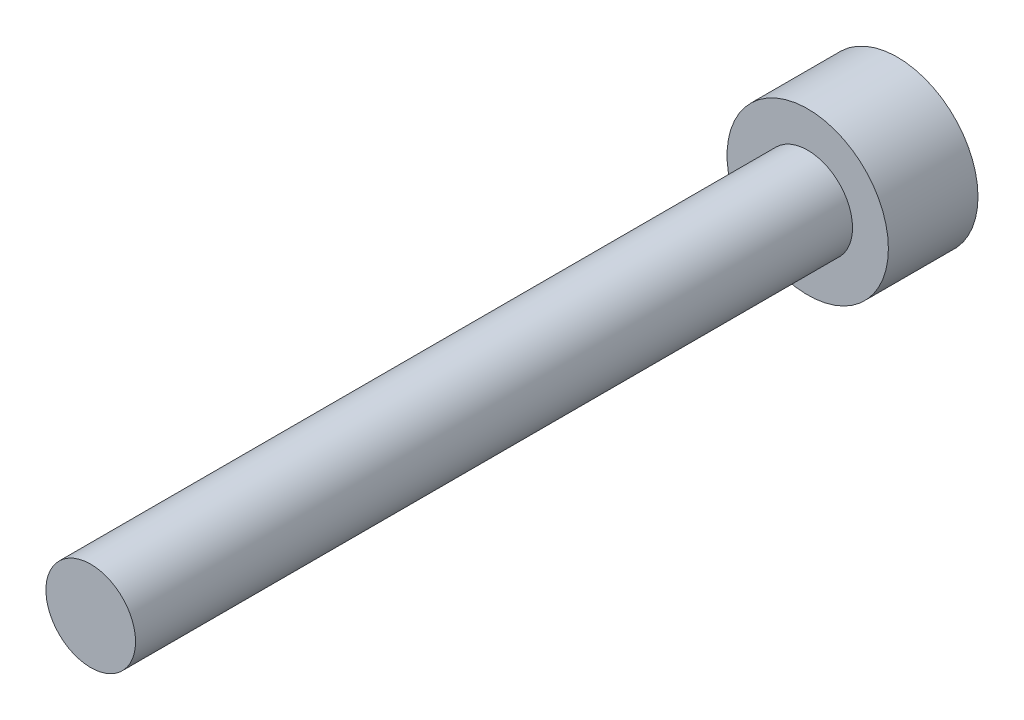
ISO-10303-21;
HEADER;
FILE_DESCRIPTION(('STEP AP214'),'2;1');
FILE_NAME('part.step','',(''),(''),'','','');
FILE_SCHEMA(('AUTOMOTIVE_DESIGN { 1 0 10303 214 1 1 1 1 }'));
ENDSEC;
DATA;
#1=APPLICATION_CONTEXT('core data for automotive mechanical design processes');
#2=APPLICATION_PROTOCOL_DEFINITION('international standard','automotive_design',2000,#1);
#3=PRODUCT_CONTEXT('',#1,'mechanical');
#4=PRODUCT('Part','Part','',(#3));
#5=PRODUCT_RELATED_PRODUCT_CATEGORY('part','',(#4));
#6=PRODUCT_DEFINITION_FORMATION('','',#4);
#7=PRODUCT_DEFINITION_CONTEXT('part definition',#1,'design');
#8=PRODUCT_DEFINITION('design','',#6,#7);
#9=PRODUCT_DEFINITION_SHAPE('','',#8);
#10=(LENGTH_UNIT() NAMED_UNIT(*) SI_UNIT(.MILLI.,.METRE.));
#11=(NAMED_UNIT(*) PLANE_ANGLE_UNIT() SI_UNIT($,.RADIAN.));
#12=(NAMED_UNIT(*) SI_UNIT($,.STERADIAN.) SOLID_ANGLE_UNIT());
#13=UNCERTAINTY_MEASURE_WITH_UNIT(LENGTH_MEASURE(1.E-05),#10,'distance_accuracy_value','');
#14=(GEOMETRIC_REPRESENTATION_CONTEXT(3) GLOBAL_UNCERTAINTY_ASSIGNED_CONTEXT((#13)) GLOBAL_UNIT_ASSIGNED_CONTEXT((#10,
#11,#12)) REPRESENTATION_CONTEXT('',''));
#15=CARTESIAN_POINT('',(0.,0.,0.));
#16=DIRECTION('',(0.,0.,1.));
#17=DIRECTION('',(1.,0.,0.));
#18=AXIS2_PLACEMENT_3D('',#15,#16,#17);
#19=CARTESIAN_POINT('',(0.,0.,-2.5));
#20=DIRECTION('',(0.,0.,1.));
#21=DIRECTION('',(1.,0.,0.));
#22=AXIS2_PLACEMENT_3D('',#19,#20,#21);
#23=PLANE('',#22);
#24=CARTESIAN_POINT('',(0.,0.,-2.5));
#25=DIRECTION('',(0.,0.,1.));
#26=DIRECTION('',(1.,0.,0.));
#27=AXIS2_PLACEMENT_3D('',#24,#25,#26);
#28=CIRCLE('',#27,2.25);
#29=CARTESIAN_POINT('',(2.25,0.,-2.5));
#30=VERTEX_POINT('',#29);
#31=EDGE_CURVE('E50',#30,#30,#28,.T.);
#32=ORIENTED_EDGE('',*,*,#31,.F.);
#33=EDGE_LOOP('',(#32));
#34=FACE_BOUND('',#33,.T.);
#35=DIRECTION('',(0.866025403784441,-0.499999999999995,0.));
#36=VECTOR('',#35,1.);
#37=CARTESIAN_POINT('',(-0.999999999999993,-0.577350269189637,-2.5));
#38=LINE('',#37,#36);
#39=CARTESIAN_POINT('',(-0.999999999999993,-0.577350269189637,-2.5));
#40=VERTEX_POINT('',#39);
#41=CARTESIAN_POINT('',(0.,-1.15470053837925,-2.5));
#42=VERTEX_POINT('',#41);
#43=EDGE_CURVE('E61',#40,#42,#38,.T.);
#44=ORIENTED_EDGE('',*,*,#43,.T.);
#45=DIRECTION('',(0.866025403784438,0.500000000000001,0.));
#46=VECTOR('',#45,1.);
#47=CARTESIAN_POINT('',(0.,-1.15470053837925,-2.5));
#48=LINE('',#47,#46);
#49=CARTESIAN_POINT('',(1.,-0.577350269189624,-2.5));
#50=VERTEX_POINT('',#49);
#51=EDGE_CURVE('E139',#42,#50,#48,.T.);
#52=ORIENTED_EDGE('',*,*,#51,.T.);
#53=DIRECTION('',(0.,1.,0.));
#54=VECTOR('',#53,1.);
#55=CARTESIAN_POINT('',(1.,-0.577350269189624,-2.5));
#56=LINE('',#55,#54);
#57=CARTESIAN_POINT('',(0.999999999999998,0.57735026918963,-2.5));
#58=VERTEX_POINT('',#57);
#59=EDGE_CURVE('E142',#50,#58,#56,.T.);
#60=ORIENTED_EDGE('',*,*,#59,.T.);
#61=DIRECTION('',(-0.866025403784442,0.499999999999995,0.));
#62=VECTOR('',#61,1.);
#63=CARTESIAN_POINT('',(0.999999999999998,0.57735026918963,-2.5));
#64=LINE('',#63,#62);
#65=CARTESIAN_POINT('',(0.,1.15470053837925,-2.5));
#66=VERTEX_POINT('',#65);
#67=EDGE_CURVE('E148',#58,#66,#64,.T.);
#68=ORIENTED_EDGE('',*,*,#67,.T.);
#69=DIRECTION('',(-0.866025403784434,-0.500000000000007,0.));
#70=VECTOR('',#69,1.);
#71=CARTESIAN_POINT('',(0.,1.15470053837925,-2.5));
#72=LINE('',#71,#70);
#73=CARTESIAN_POINT('',(-1.00000000000001,0.577350269189617,-2.5));
#74=VERTEX_POINT('',#73);
#75=EDGE_CURVE('E124',#66,#74,#72,.T.);
#76=ORIENTED_EDGE('',*,*,#75,.T.);
#77=DIRECTION('',(0.,-1.,0.));
#78=VECTOR('',#77,1.);
#79=CARTESIAN_POINT('',(-1.00000000000001,0.577350269189617,-2.5));
#80=LINE('',#79,#78);
#81=EDGE_CURVE('E151',#74,#40,#80,.T.);
#82=ORIENTED_EDGE('',*,*,#81,.T.);
#83=EDGE_LOOP('',(#44,#52,#60,#68,#76,#82));
#84=FACE_BOUND('',#83,.T.);
#85=ADVANCED_FACE('F43',(#34,#84),#23,.F.);
#86=CARTESIAN_POINT('',(0.,0.,0.));
#87=DIRECTION('',(0.,0.,-1.));
#88=DIRECTION('',(-1.,0.,0.));
#89=AXIS2_PLACEMENT_3D('',#86,#87,#88);
#90=CYLINDRICAL_SURFACE('',#89,2.25);
#91=CARTESIAN_POINT('',(0.,0.,0.));
#92=DIRECTION('',(0.,0.,1.));
#93=DIRECTION('',(1.,0.,0.));
#94=AXIS2_PLACEMENT_3D('',#91,#92,#93);
#95=CIRCLE('',#94,2.25);
#96=CARTESIAN_POINT('',(2.25,0.,0.));
#97=VERTEX_POINT('',#96);
#98=EDGE_CURVE('E52',#97,#97,#95,.T.);
#99=ORIENTED_EDGE('',*,*,#98,.F.);
#100=EDGE_LOOP('',(#99));
#101=FACE_BOUND('',#100,.T.);
#102=ORIENTED_EDGE('',*,*,#31,.T.);
#103=EDGE_LOOP('',(#102));
#104=FACE_BOUND('',#103,.T.);
#105=ADVANCED_FACE('F44',(#101,#104),#90,.T.);
#106=CARTESIAN_POINT('',(0.,0.,0.));
#107=DIRECTION('',(0.,0.,1.));
#108=DIRECTION('',(1.,0.,0.));
#109=AXIS2_PLACEMENT_3D('',#106,#107,#108);
#110=PLANE('',#109);
#111=CARTESIAN_POINT('',(0.,0.,0.));
#112=DIRECTION('',(0.,0.,1.));
#113=DIRECTION('',(1.,0.,0.));
#114=AXIS2_PLACEMENT_3D('',#111,#112,#113);
#115=CIRCLE('',#114,1.25);
#116=CARTESIAN_POINT('',(1.25,0.,0.));
#117=VERTEX_POINT('',#116);
#118=EDGE_CURVE('E11',#117,#117,#115,.T.);
#119=ORIENTED_EDGE('',*,*,#118,.F.);
#120=EDGE_LOOP('',(#119));
#121=FACE_BOUND('',#120,.T.);
#122=ORIENTED_EDGE('',*,*,#98,.T.);
#123=EDGE_LOOP('',(#122));
#124=FACE_BOUND('',#123,.T.);
#125=ADVANCED_FACE('F211',(#121,#124),#110,.T.);
#126=CARTESIAN_POINT('',(0.,0.,20.));
#127=DIRECTION('',(0.,0.,-1.));
#128=DIRECTION('',(-1.,0.,0.));
#129=AXIS2_PLACEMENT_3D('',#126,#127,#128);
#130=CYLINDRICAL_SURFACE('',#129,1.25);
#131=CARTESIAN_POINT('',(0.,0.,20.));
#132=DIRECTION('',(0.,0.,1.));
#133=DIRECTION('',(1.,0.,0.));
#134=AXIS2_PLACEMENT_3D('',#131,#132,#133);
#135=CIRCLE('',#134,1.25);
#136=CARTESIAN_POINT('',(1.25,0.,20.));
#137=VERTEX_POINT('',#136);
#138=EDGE_CURVE('E170',#137,#137,#135,.T.);
#139=ORIENTED_EDGE('',*,*,#138,.F.);
#140=EDGE_LOOP('',(#139));
#141=FACE_BOUND('',#140,.T.);
#142=ORIENTED_EDGE('',*,*,#118,.T.);
#143=EDGE_LOOP('',(#142));
#144=FACE_BOUND('',#143,.T.);
#145=ADVANCED_FACE('F210',(#141,#144),#130,.T.);
#146=CARTESIAN_POINT('',(0.,0.,20.));
#147=DIRECTION('',(0.,0.,1.));
#148=DIRECTION('',(1.,0.,0.));
#149=AXIS2_PLACEMENT_3D('',#146,#147,#148);
#150=PLANE('',#149);
#151=ORIENTED_EDGE('',*,*,#138,.T.);
#152=EDGE_LOOP('',(#151));
#153=FACE_BOUND('',#152,.T.);
#154=ADVANCED_FACE('F203',(#153),#150,.T.);
#155=CARTESIAN_POINT('',(-0.999999999999993,-0.577350269189637,-1.25));
#156=DIRECTION('',(0.499999999999995,0.866025403784441,0.));
#157=DIRECTION('',(-0.866025403784441,0.499999999999995,0.));
#158=AXIS2_PLACEMENT_3D('',#155,#156,#157);
#159=PLANE('',#158);
#160=ORIENTED_EDGE('',*,*,#43,.F.);
#161=DIRECTION('',(0.,0.,-1.));
#162=VECTOR('',#161,1.);
#163=CARTESIAN_POINT('',(-0.999999999999993,-0.577350269189637,-1.25));
#164=LINE('',#163,#162);
#165=CARTESIAN_POINT('',(-0.999999999999993,-0.577350269189637,-1.25));
#166=VERTEX_POINT('',#165);
#167=EDGE_CURVE('E135',#166,#40,#164,.T.);
#168=ORIENTED_EDGE('',*,*,#167,.F.);
#169=DIRECTION('',(0.866025403784441,-0.499999999999995,0.));
#170=VECTOR('',#169,1.);
#171=CARTESIAN_POINT('',(-0.999999999999993,-0.577350269189637,-1.25));
#172=LINE('',#171,#170);
#173=CARTESIAN_POINT('',(0.,-1.15470053837925,-1.25));
#174=VERTEX_POINT('',#173);
#175=EDGE_CURVE('E152',#166,#174,#172,.T.);
#176=ORIENTED_EDGE('',*,*,#175,.T.);
#177=DIRECTION('',(0.,0.,-1.));
#178=VECTOR('',#177,1.);
#179=CARTESIAN_POINT('',(0.,-1.15470053837925,-1.25));
#180=LINE('',#179,#178);
#181=EDGE_CURVE('E163',#174,#42,#180,.T.);
#182=ORIENTED_EDGE('',*,*,#181,.T.);
#183=EDGE_LOOP('',(#160,#168,#176,#182));
#184=FACE_BOUND('',#183,.T.);
#185=ADVANCED_FACE('F185',(#184),#159,.T.);
#186=CARTESIAN_POINT('',(0.,-1.15470053837925,-1.25));
#187=DIRECTION('',(-0.500000000000001,0.866025403784438,0.));
#188=DIRECTION('',(-0.866025403784438,-0.500000000000001,0.));
#189=AXIS2_PLACEMENT_3D('',#186,#187,#188);
#190=PLANE('',#189);
#191=ORIENTED_EDGE('',*,*,#51,.F.);
#192=ORIENTED_EDGE('',*,*,#181,.F.);
#193=DIRECTION('',(0.866025403784438,0.500000000000001,0.));
#194=VECTOR('',#193,1.);
#195=CARTESIAN_POINT('',(0.,-1.15470053837925,-1.25));
#196=LINE('',#195,#194);
#197=CARTESIAN_POINT('',(1.,-0.577350269189624,-1.25));
#198=VERTEX_POINT('',#197);
#199=EDGE_CURVE('E99',#174,#198,#196,.T.);
#200=ORIENTED_EDGE('',*,*,#199,.T.);
#201=DIRECTION('',(0.,0.,-1.));
#202=VECTOR('',#201,1.);
#203=CARTESIAN_POINT('',(1.,-0.577350269189624,-1.25));
#204=LINE('',#203,#202);
#205=EDGE_CURVE('E161',#198,#50,#204,.T.);
#206=ORIENTED_EDGE('',*,*,#205,.T.);
#207=EDGE_LOOP('',(#191,#192,#200,#206));
#208=FACE_BOUND('',#207,.T.);
#209=ADVANCED_FACE('F193',(#208),#190,.T.);
#210=CARTESIAN_POINT('',(1.,-0.577350269189624,-1.25));
#211=DIRECTION('',(-1.,0.,0.));
#212=DIRECTION('',(0.,-1.,0.));
#213=AXIS2_PLACEMENT_3D('',#210,#211,#212);
#214=PLANE('',#213);
#215=ORIENTED_EDGE('',*,*,#59,.F.);
#216=ORIENTED_EDGE('',*,*,#205,.F.);
#217=DIRECTION('',(0.,1.,0.));
#218=VECTOR('',#217,1.);
#219=CARTESIAN_POINT('',(1.,-0.577350269189624,-1.25));
#220=LINE('',#219,#218);
#221=CARTESIAN_POINT('',(0.999999999999998,0.57735026918963,-1.25));
#222=VERTEX_POINT('',#221);
#223=EDGE_CURVE('E118',#198,#222,#220,.T.);
#224=ORIENTED_EDGE('',*,*,#223,.T.);
#225=DIRECTION('',(0.,0.,-1.));
#226=VECTOR('',#225,1.);
#227=CARTESIAN_POINT('',(0.999999999999998,0.57735026918963,-1.25));
#228=LINE('',#227,#226);
#229=EDGE_CURVE('E113',#222,#58,#228,.T.);
#230=ORIENTED_EDGE('',*,*,#229,.T.);
#231=EDGE_LOOP('',(#215,#216,#224,#230));
#232=FACE_BOUND('',#231,.T.);
#233=ADVANCED_FACE('F192',(#232),#214,.T.);
#234=CARTESIAN_POINT('',(0.999999999999998,0.57735026918963,-1.25));
#235=DIRECTION('',(-0.499999999999995,-0.866025403784442,0.));
#236=DIRECTION('',(0.866025403784442,-0.499999999999995,0.));
#237=AXIS2_PLACEMENT_3D('',#234,#235,#236);
#238=PLANE('',#237);
#239=ORIENTED_EDGE('',*,*,#67,.F.);
#240=ORIENTED_EDGE('',*,*,#229,.F.);
#241=DIRECTION('',(-0.866025403784442,0.499999999999995,0.));
#242=VECTOR('',#241,1.);
#243=CARTESIAN_POINT('',(0.999999999999998,0.57735026918963,-1.25));
#244=LINE('',#243,#242);
#245=CARTESIAN_POINT('',(0.,1.15470053837925,-1.25));
#246=VERTEX_POINT('',#245);
#247=EDGE_CURVE('E109',#222,#246,#244,.T.);
#248=ORIENTED_EDGE('',*,*,#247,.T.);
#249=DIRECTION('',(0.,0.,-1.));
#250=VECTOR('',#249,1.);
#251=CARTESIAN_POINT('',(0.,1.15470053837925,-1.25));
#252=LINE('',#251,#250);
#253=EDGE_CURVE('E111',#246,#66,#252,.T.);
#254=ORIENTED_EDGE('',*,*,#253,.T.);
#255=EDGE_LOOP('',(#239,#240,#248,#254));
#256=FACE_BOUND('',#255,.T.);
#257=ADVANCED_FACE('F114',(#256),#238,.T.);
#258=CARTESIAN_POINT('',(0.,1.15470053837925,-1.25));
#259=DIRECTION('',(0.500000000000007,-0.866025403784435,0.));
#260=DIRECTION('',(0.866025403784435,0.500000000000007,0.));
#261=AXIS2_PLACEMENT_3D('',#258,#259,#260);
#262=PLANE('',#261);
#263=ORIENTED_EDGE('',*,*,#75,.F.);
#264=ORIENTED_EDGE('',*,*,#253,.F.);
#265=DIRECTION('',(-0.866025403784434,-0.500000000000007,0.));
#266=VECTOR('',#265,1.);
#267=CARTESIAN_POINT('',(0.,1.15470053837925,-1.25));
#268=LINE('',#267,#266);
#269=CARTESIAN_POINT('',(-1.00000000000001,0.577350269189617,-1.25));
#270=VERTEX_POINT('',#269);
#271=EDGE_CURVE('E117',#246,#270,#268,.T.);
#272=ORIENTED_EDGE('',*,*,#271,.T.);
#273=DIRECTION('',(0.,0.,-1.));
#274=VECTOR('',#273,1.);
#275=CARTESIAN_POINT('',(-1.00000000000001,0.577350269189617,-1.25));
#276=LINE('',#275,#274);
#277=EDGE_CURVE('E93',#270,#74,#276,.T.);
#278=ORIENTED_EDGE('',*,*,#277,.T.);
#279=EDGE_LOOP('',(#263,#264,#272,#278));
#280=FACE_BOUND('',#279,.T.);
#281=ADVANCED_FACE('F121',(#280),#262,.T.);
#282=CARTESIAN_POINT('',(-1.00000000000001,0.577350269189617,-1.25));
#283=DIRECTION('',(1.,0.,0.));
#284=DIRECTION('',(0.,1.,0.));
#285=AXIS2_PLACEMENT_3D('',#282,#283,#284);
#286=PLANE('',#285);
#287=ORIENTED_EDGE('',*,*,#81,.F.);
#288=ORIENTED_EDGE('',*,*,#277,.F.);
#289=DIRECTION('',(0.,-1.,0.));
#290=VECTOR('',#289,1.);
#291=CARTESIAN_POINT('',(-1.00000000000001,0.577350269189617,-1.25));
#292=LINE('',#291,#290);
#293=EDGE_CURVE('E68',#270,#166,#292,.T.);
#294=ORIENTED_EDGE('',*,*,#293,.T.);
#295=ORIENTED_EDGE('',*,*,#167,.T.);
#296=EDGE_LOOP('',(#287,#288,#294,#295));
#297=FACE_BOUND('',#296,.T.);
#298=ADVANCED_FACE('F182',(#297),#286,.T.);
#299=CARTESIAN_POINT('',(0.,0.,-1.25));
#300=DIRECTION('',(0.,0.,1.));
#301=DIRECTION('',(1.,0.,0.));
#302=AXIS2_PLACEMENT_3D('',#299,#300,#301);
#303=PLANE('',#302);
#304=ORIENTED_EDGE('',*,*,#175,.F.);
#305=ORIENTED_EDGE('',*,*,#293,.F.);
#306=ORIENTED_EDGE('',*,*,#271,.F.);
#307=ORIENTED_EDGE('',*,*,#247,.F.);
#308=ORIENTED_EDGE('',*,*,#223,.F.);
#309=ORIENTED_EDGE('',*,*,#199,.F.);
#310=EDGE_LOOP('',(#304,#305,#306,#307,#308,#309));
#311=FACE_BOUND('',#310,.T.);
#312=ADVANCED_FACE('F130',(#311),#303,.F.);
#313=CLOSED_SHELL('',(#85,#105,#125,#145,#154,#185,#209,#233,#257,#281,#298,#312));
#314=MANIFOLD_SOLID_BREP('B2',#313);
#315=ADVANCED_BREP_SHAPE_REPRESENTATION('',(#18,#314),#14);
#316=SHAPE_DEFINITION_REPRESENTATION(#9,#315);
ENDSEC;
END-ISO-10303-21;
